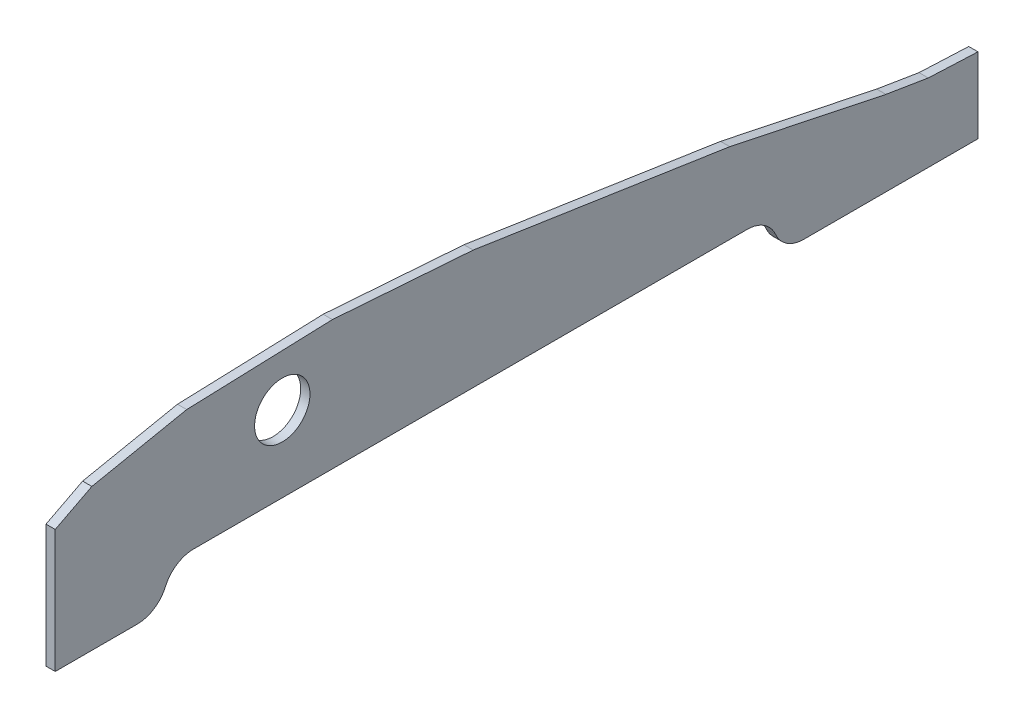
ISO-10303-21;
HEADER;
FILE_DESCRIPTION(('STEP AP214'),'2;1');
FILE_NAME('part.step','',(''),(''),'','','');
FILE_SCHEMA(('AUTOMOTIVE_DESIGN { 1 0 10303 214 1 1 1 1 }'));
ENDSEC;
DATA;
#1=APPLICATION_CONTEXT('core data for automotive mechanical design processes');
#2=APPLICATION_PROTOCOL_DEFINITION('international standard','automotive_design',2000,#1);
#3=PRODUCT_CONTEXT('',#1,'mechanical');
#4=PRODUCT('Part','Part','',(#3));
#5=PRODUCT_RELATED_PRODUCT_CATEGORY('part','',(#4));
#6=PRODUCT_DEFINITION_FORMATION('','',#4);
#7=PRODUCT_DEFINITION_CONTEXT('part definition',#1,'design');
#8=PRODUCT_DEFINITION('design','',#6,#7);
#9=PRODUCT_DEFINITION_SHAPE('','',#8);
#10=(LENGTH_UNIT() NAMED_UNIT(*) SI_UNIT(.MILLI.,.METRE.));
#11=(NAMED_UNIT(*) PLANE_ANGLE_UNIT() SI_UNIT($,.RADIAN.));
#12=(NAMED_UNIT(*) SI_UNIT($,.STERADIAN.) SOLID_ANGLE_UNIT());
#13=UNCERTAINTY_MEASURE_WITH_UNIT(LENGTH_MEASURE(1.E-05),#10,'distance_accuracy_value','');
#14=(GEOMETRIC_REPRESENTATION_CONTEXT(3) GLOBAL_UNCERTAINTY_ASSIGNED_CONTEXT((#13)) GLOBAL_UNIT_ASSIGNED_CONTEXT((#10,
#11,#12)) REPRESENTATION_CONTEXT('',''));
#15=CARTESIAN_POINT('',(0.,0.,0.));
#16=DIRECTION('',(0.,0.,1.));
#17=DIRECTION('',(1.,0.,0.));
#18=AXIS2_PLACEMENT_3D('',#15,#16,#17);
#19=CARTESIAN_POINT('',(3.,-40.,0.));
#20=DIRECTION('',(0.,1.,0.));
#21=DIRECTION('',(0.,0.,1.));
#22=AXIS2_PLACEMENT_3D('',#19,#20,#21);
#23=PLANE('',#22);
#24=DIRECTION('',(0.,0.,-1.));
#25=VECTOR('',#24,1.);
#26=CARTESIAN_POINT('',(0.,-40.,0.));
#27=LINE('',#26,#25);
#28=CARTESIAN_POINT('',(0.,-40.,0.));
#29=VERTEX_POINT('',#28);
#30=CARTESIAN_POINT('',(0.,-40.,-26.6696972201766));
#31=VERTEX_POINT('',#30);
#32=EDGE_CURVE('E221',#29,#31,#27,.T.);
#33=ORIENTED_EDGE('',*,*,#32,.T.);
#34=DIRECTION('',(1.,0.,0.));
#35=VECTOR('',#34,1.);
#36=CARTESIAN_POINT('',(3.,-40.,-26.6696972201766));
#37=LINE('',#36,#35);
#38=CARTESIAN_POINT('',(3.,-40.,-26.6696972201766));
#39=VERTEX_POINT('',#38);
#40=EDGE_CURVE('E45',#31,#39,#37,.T.);
#41=ORIENTED_EDGE('',*,*,#40,.T.);
#42=DIRECTION('',(0.,0.,-1.));
#43=VECTOR('',#42,1.);
#44=CARTESIAN_POINT('',(3.,-40.,0.));
#45=LINE('',#44,#43);
#46=CARTESIAN_POINT('',(3.,-40.,0.));
#47=VERTEX_POINT('',#46);
#48=EDGE_CURVE('E196',#47,#39,#45,.T.);
#49=ORIENTED_EDGE('',*,*,#48,.F.);
#50=DIRECTION('',(-1.,0.,0.));
#51=VECTOR('',#50,1.);
#52=CARTESIAN_POINT('',(3.,-40.,0.));
#53=LINE('',#52,#51);
#54=EDGE_CURVE('E269',#47,#29,#53,.T.);
#55=ORIENTED_EDGE('',*,*,#54,.T.);
#56=EDGE_LOOP('',(#33,#41,#49,#55));
#57=FACE_BOUND('',#56,.T.);
#58=ADVANCED_FACE('F37',(#57),#23,.F.);
#59=CARTESIAN_POINT('',(3.,0.,0.));
#60=DIRECTION('',(0.,0.,-1.));
#61=DIRECTION('',(0.,1.,0.));
#62=AXIS2_PLACEMENT_3D('',#59,#60,#61);
#63=PLANE('',#62);
#64=DIRECTION('',(0.,-1.,0.));
#65=VECTOR('',#64,1.);
#66=CARTESIAN_POINT('',(0.,0.,0.));
#67=LINE('',#66,#65);
#68=CARTESIAN_POINT('',(0.,0.,0.));
#69=VERTEX_POINT('',#68);
#70=EDGE_CURVE('E189',#69,#29,#67,.T.);
#71=ORIENTED_EDGE('',*,*,#70,.T.);
#72=ORIENTED_EDGE('',*,*,#54,.F.);
#73=DIRECTION('',(0.,-1.,0.));
#74=VECTOR('',#73,1.);
#75=CARTESIAN_POINT('',(3.,0.,0.));
#76=LINE('',#75,#74);
#77=CARTESIAN_POINT('',(3.,0.,0.));
#78=VERTEX_POINT('',#77);
#79=EDGE_CURVE('E191',#78,#47,#76,.T.);
#80=ORIENTED_EDGE('',*,*,#79,.F.);
#81=DIRECTION('',(-1.,0.,0.));
#82=VECTOR('',#81,1.);
#83=CARTESIAN_POINT('',(3.,0.,0.));
#84=LINE('',#83,#82);
#85=EDGE_CURVE('E217',#78,#69,#84,.T.);
#86=ORIENTED_EDGE('',*,*,#85,.T.);
#87=EDGE_LOOP('',(#71,#72,#80,#86));
#88=FACE_BOUND('',#87,.T.);
#89=ADVANCED_FACE('F293',(#88),#63,.F.);
#90=CARTESIAN_POINT('',(3.,-40.,-243.330302779823));
#91=VERTEX_POINT('',#90);
#92=CARTESIAN_POINT('',(3.,-40.,-299.988096251268));
#93=VERTEX_POINT('',#92);
#94=EDGE_CURVE('E194',#91,#93,#45,.T.);
#95=ORIENTED_EDGE('',*,*,#94,.F.);
#96=DIRECTION('',(1.,0.,0.));
#97=VECTOR('',#96,1.);
#98=CARTESIAN_POINT('',(3.,-40.,-243.330302779823));
#99=LINE('',#98,#97);
#100=CARTESIAN_POINT('',(0.,-40.,-243.330302779823));
#101=VERTEX_POINT('',#100);
#102=EDGE_CURVE('E278',#91,#101,#99,.F.);
#103=ORIENTED_EDGE('',*,*,#102,.T.);
#104=CARTESIAN_POINT('',(0.,-40.,-299.988096251268));
#105=VERTEX_POINT('',#104);
#106=EDGE_CURVE('E220',#101,#105,#27,.T.);
#107=ORIENTED_EDGE('',*,*,#106,.T.);
#108=DIRECTION('',(-1.,0.,0.));
#109=VECTOR('',#108,1.);
#110=CARTESIAN_POINT('',(3.,-40.,-299.988096251268));
#111=LINE('',#110,#109);
#112=EDGE_CURVE('E266',#93,#105,#111,.T.);
#113=ORIENTED_EDGE('',*,*,#112,.F.);
#114=EDGE_LOOP('',(#95,#103,#107,#113));
#115=FACE_BOUND('',#114,.T.);
#116=ADVANCED_FACE('F355',(#115),#23,.F.);
#117=CARTESIAN_POINT('',(3.,-40.,-299.988096251268));
#118=DIRECTION('',(0.,0.,1.));
#119=DIRECTION('',(1.,0.,0.));
#120=AXIS2_PLACEMENT_3D('',#117,#118,#119);
#121=PLANE('',#120);
#122=DIRECTION('',(0.,1.,0.));
#123=VECTOR('',#122,1.);
#124=CARTESIAN_POINT('',(0.,-40.,-299.988096251268));
#125=LINE('',#124,#123);
#126=CARTESIAN_POINT('',(0.,-15.5173621646129,-299.988096251268));
#127=VERTEX_POINT('',#126);
#128=EDGE_CURVE('E223',#105,#127,#125,.T.);
#129=ORIENTED_EDGE('',*,*,#128,.T.);
#130=DIRECTION('',(-1.,0.,0.));
#131=VECTOR('',#130,1.);
#132=CARTESIAN_POINT('',(3.,-15.5173621646129,-299.988096251268));
#133=LINE('',#132,#131);
#134=CARTESIAN_POINT('',(3.,-15.5173621646129,-299.988096251268));
#135=VERTEX_POINT('',#134);
#136=EDGE_CURVE('E263',#135,#127,#133,.T.);
#137=ORIENTED_EDGE('',*,*,#136,.F.);
#138=DIRECTION('',(0.,1.,0.));
#139=VECTOR('',#138,1.);
#140=CARTESIAN_POINT('',(3.,-40.,-299.988096251268));
#141=LINE('',#140,#139);
#142=EDGE_CURVE('E199',#93,#135,#141,.T.);
#143=ORIENTED_EDGE('',*,*,#142,.F.);
#144=ORIENTED_EDGE('',*,*,#112,.T.);
#145=EDGE_LOOP('',(#129,#137,#143,#144));
#146=FACE_BOUND('',#145,.T.);
#147=ADVANCED_FACE('F337',(#146),#121,.F.);
#148=CARTESIAN_POINT('',(3.,-14.7928826141457,-283.82314628147));
#149=DIRECTION('',(0.,-0.998997187171861,0.0447729831785717));
#150=DIRECTION('',(0.,-0.0447729831785717,-0.998997187171862));
#151=AXIS2_PLACEMENT_3D('',#148,#149,#150);
#152=PLANE('',#151);
#153=DIRECTION('',(0.,0.0447729831785717,0.998997187171862));
#154=VECTOR('',#153,1.);
#155=CARTESIAN_POINT('',(0.,-14.7928826141457,-283.82314628147));
#156=LINE('',#155,#154);
#157=CARTESIAN_POINT('',(0.,-14.7928826141457,-283.82314628147));
#158=VERTEX_POINT('',#157);
#159=EDGE_CURVE('E225',#127,#158,#156,.T.);
#160=ORIENTED_EDGE('',*,*,#159,.T.);
#161=DIRECTION('',(-1.,0.,0.));
#162=VECTOR('',#161,1.);
#163=CARTESIAN_POINT('',(3.,-14.7928826141457,-283.82314628147));
#164=LINE('',#163,#162);
#165=CARTESIAN_POINT('',(3.,-14.7928826141457,-283.82314628147));
#166=VERTEX_POINT('',#165);
#167=EDGE_CURVE('E260',#166,#158,#164,.T.);
#168=ORIENTED_EDGE('',*,*,#167,.F.);
#169=DIRECTION('',(0.,0.0447729831785717,0.998997187171862));
#170=VECTOR('',#169,1.);
#171=CARTESIAN_POINT('',(3.,-14.7928826141457,-283.82314628147));
#172=LINE('',#171,#170);
#173=EDGE_CURVE('E201',#135,#166,#172,.T.);
#174=ORIENTED_EDGE('',*,*,#173,.F.);
#175=ORIENTED_EDGE('',*,*,#136,.T.);
#176=EDGE_LOOP('',(#160,#168,#174,#175));
#177=FACE_BOUND('',#176,.T.);
#178=ADVANCED_FACE('F333',(#177),#152,.F.);
#179=CARTESIAN_POINT('',(3.,-12.5326394818578,-270.057015240594));
#180=DIRECTION('',(0.,-0.986787578203205,0.162019367681314));
#181=DIRECTION('',(0.,-0.162019367681314,-0.986787578203206));
#182=AXIS2_PLACEMENT_3D('',#179,#180,#181);
#183=PLANE('',#182);
#184=DIRECTION('',(0.,0.162019367681314,0.986787578203205));
#185=VECTOR('',#184,1.);
#186=CARTESIAN_POINT('',(0.,-12.5326394818578,-270.057015240594));
#187=LINE('',#186,#185);
#188=CARTESIAN_POINT('',(0.,-12.5326394818578,-270.057015240594));
#189=VERTEX_POINT('',#188);
#190=EDGE_CURVE('E227',#158,#189,#187,.T.);
#191=ORIENTED_EDGE('',*,*,#190,.T.);
#192=DIRECTION('',(-1.,0.,0.));
#193=VECTOR('',#192,1.);
#194=CARTESIAN_POINT('',(3.,-12.5326394818578,-270.057015240594));
#195=LINE('',#194,#193);
#196=CARTESIAN_POINT('',(3.,-12.5326394818578,-270.057015240594));
#197=VERTEX_POINT('',#196);
#198=EDGE_CURVE('E257',#197,#189,#195,.T.);
#199=ORIENTED_EDGE('',*,*,#198,.F.);
#200=DIRECTION('',(0.,0.162019367681314,0.986787578203205));
#201=VECTOR('',#200,1.);
#202=CARTESIAN_POINT('',(3.,-12.5326394818578,-270.057015240594));
#203=LINE('',#202,#201);
#204=EDGE_CURVE('E203',#166,#197,#203,.T.);
#205=ORIENTED_EDGE('',*,*,#204,.F.);
#206=ORIENTED_EDGE('',*,*,#167,.T.);
#207=EDGE_LOOP('',(#191,#199,#205,#206));
#208=FACE_BOUND('',#207,.T.);
#209=ADVANCED_FACE('F328',(#208),#183,.F.);
#210=CARTESIAN_POINT('',(3.,-1.87671343063835,-219.28748806685));
#211=DIRECTION('',(0.,-0.97867549249327,0.205412464064515));
#212=DIRECTION('',(0.,-0.205412464064515,-0.97867549249327));
#213=AXIS2_PLACEMENT_3D('',#210,#211,#212);
#214=PLANE('',#213);
#215=DIRECTION('',(0.,0.205412464064515,0.97867549249327));
#216=VECTOR('',#215,1.);
#217=CARTESIAN_POINT('',(0.,-1.87671343063835,-219.28748806685));
#218=LINE('',#217,#216);
#219=CARTESIAN_POINT('',(0.,-1.87671343063835,-219.28748806685));
#220=VERTEX_POINT('',#219);
#221=EDGE_CURVE('E229',#189,#220,#218,.T.);
#222=ORIENTED_EDGE('',*,*,#221,.T.);
#223=DIRECTION('',(-1.,0.,0.));
#224=VECTOR('',#223,1.);
#225=CARTESIAN_POINT('',(3.,-1.87671343063835,-219.28748806685));
#226=LINE('',#225,#224);
#227=CARTESIAN_POINT('',(3.,-1.87671343063835,-219.28748806685));
#228=VERTEX_POINT('',#227);
#229=EDGE_CURVE('E254',#228,#220,#226,.T.);
#230=ORIENTED_EDGE('',*,*,#229,.F.);
#231=DIRECTION('',(0.,0.205412464064515,0.97867549249327));
#232=VECTOR('',#231,1.);
#233=CARTESIAN_POINT('',(3.,-1.87671343063835,-219.28748806685));
#234=LINE('',#233,#232);
#235=EDGE_CURVE('E205',#197,#228,#234,.T.);
#236=ORIENTED_EDGE('',*,*,#235,.F.);
#237=ORIENTED_EDGE('',*,*,#198,.T.);
#238=EDGE_LOOP('',(#222,#230,#236,#237));
#239=FACE_BOUND('',#238,.T.);
#240=ADVANCED_FACE('F322',(#239),#214,.F.);
#241=CARTESIAN_POINT('',(3.,10.7137046441607,-135.887385091605));
#242=DIRECTION('',(0.,-0.988796071204043,0.149272668534629));
#243=DIRECTION('',(0.,-0.149272668534629,-0.988796071204043));
#244=AXIS2_PLACEMENT_3D('',#241,#242,#243);
#245=PLANE('',#244);
#246=DIRECTION('',(0.,0.149272668534629,0.988796071204043));
#247=VECTOR('',#246,1.);
#248=CARTESIAN_POINT('',(0.,10.7137046441607,-135.887385091605));
#249=LINE('',#248,#247);
#250=CARTESIAN_POINT('',(0.,10.7137046441607,-135.887385091605));
#251=VERTEX_POINT('',#250);
#252=EDGE_CURVE('E231',#220,#251,#249,.T.);
#253=ORIENTED_EDGE('',*,*,#252,.T.);
#254=DIRECTION('',(-1.,0.,0.));
#255=VECTOR('',#254,1.);
#256=CARTESIAN_POINT('',(3.,10.7137046441607,-135.887385091605));
#257=LINE('',#256,#255);
#258=CARTESIAN_POINT('',(3.,10.7137046441607,-135.887385091605));
#259=VERTEX_POINT('',#258);
#260=EDGE_CURVE('E251',#259,#251,#257,.T.);
#261=ORIENTED_EDGE('',*,*,#260,.F.);
#262=DIRECTION('',(0.,0.149272668534629,0.988796071204043));
#263=VECTOR('',#262,1.);
#264=CARTESIAN_POINT('',(3.,10.7137046441607,-135.887385091605));
#265=LINE('',#264,#263);
#266=EDGE_CURVE('E207',#228,#259,#265,.T.);
#267=ORIENTED_EDGE('',*,*,#266,.F.);
#268=ORIENTED_EDGE('',*,*,#229,.T.);
#269=EDGE_LOOP('',(#253,#261,#267,#268));
#270=FACE_BOUND('',#269,.T.);
#271=ADVANCED_FACE('F318',(#270),#245,.F.);
#272=CARTESIAN_POINT('',(3.,14.0331367749664,-90.1067818042896));
#273=DIRECTION('',(0.,-0.997381658666845,0.0723175425119892));
#274=DIRECTION('',(0.,-0.0723175425119892,-0.997381658666845));
#275=AXIS2_PLACEMENT_3D('',#272,#273,#274);
#276=PLANE('',#275);
#277=DIRECTION('',(0.,0.0723175425119892,0.997381658666845));
#278=VECTOR('',#277,1.);
#279=CARTESIAN_POINT('',(0.,14.0331367749664,-90.1067818042896));
#280=LINE('',#279,#278);
#281=CARTESIAN_POINT('',(0.,14.0331367749664,-90.1067818042896));
#282=VERTEX_POINT('',#281);
#283=EDGE_CURVE('E233',#251,#282,#280,.T.);
#284=ORIENTED_EDGE('',*,*,#283,.T.);
#285=DIRECTION('',(-1.,0.,0.));
#286=VECTOR('',#285,1.);
#287=CARTESIAN_POINT('',(3.,14.0331367749664,-90.1067818042896));
#288=LINE('',#287,#286);
#289=CARTESIAN_POINT('',(3.,14.0331367749664,-90.1067818042896));
#290=VERTEX_POINT('',#289);
#291=EDGE_CURVE('E248',#290,#282,#288,.T.);
#292=ORIENTED_EDGE('',*,*,#291,.F.);
#293=DIRECTION('',(0.,0.0723175425119892,0.997381658666845));
#294=VECTOR('',#293,1.);
#295=CARTESIAN_POINT('',(3.,14.0331367749664,-90.1067818042896));
#296=LINE('',#295,#294);
#297=EDGE_CURVE('E209',#259,#290,#296,.T.);
#298=ORIENTED_EDGE('',*,*,#297,.F.);
#299=ORIENTED_EDGE('',*,*,#260,.T.);
#300=EDGE_LOOP('',(#284,#292,#298,#299));
#301=FACE_BOUND('',#300,.T.);
#302=ADVANCED_FACE('F313',(#301),#276,.F.);
#303=CARTESIAN_POINT('',(3.,12.3835210947957,-42.7394147653279));
#304=DIRECTION('',(0.,-0.99939412611154,-0.0348048946809296));
#305=DIRECTION('',(0.,0.0348048946809296,-0.99939412611154));
#306=AXIS2_PLACEMENT_3D('',#303,#304,#305);
#307=PLANE('',#306);
#308=DIRECTION('',(0.,-0.0348048946809296,0.99939412611154));
#309=VECTOR('',#308,1.);
#310=CARTESIAN_POINT('',(0.,12.3835210947957,-42.7394147653279));
#311=LINE('',#310,#309);
#312=CARTESIAN_POINT('',(0.,12.3835210947957,-42.7394147653279));
#313=VERTEX_POINT('',#312);
#314=EDGE_CURVE('E235',#282,#313,#311,.T.);
#315=ORIENTED_EDGE('',*,*,#314,.T.);
#316=DIRECTION('',(-1.,0.,0.));
#317=VECTOR('',#316,1.);
#318=CARTESIAN_POINT('',(3.,12.3835210947957,-42.7394147653279));
#319=LINE('',#318,#317);
#320=CARTESIAN_POINT('',(3.,12.3835210947957,-42.7394147653279));
#321=VERTEX_POINT('',#320);
#322=EDGE_CURVE('E245',#321,#313,#319,.T.);
#323=ORIENTED_EDGE('',*,*,#322,.F.);
#324=DIRECTION('',(0.,-0.0348048946809296,0.99939412611154));
#325=VECTOR('',#324,1.);
#326=CARTESIAN_POINT('',(3.,12.3835210947957,-42.7394147653279));
#327=LINE('',#326,#325);
#328=EDGE_CURVE('E211',#290,#321,#327,.T.);
#329=ORIENTED_EDGE('',*,*,#328,.F.);
#330=ORIENTED_EDGE('',*,*,#291,.T.);
#331=EDGE_LOOP('',(#315,#323,#329,#330));
#332=FACE_BOUND('',#331,.T.);
#333=ADVANCED_FACE('F307',(#332),#307,.F.);
#334=CARTESIAN_POINT('',(3.,6.15800492790661,-11.9107980940931));
#335=DIRECTION('',(0.,-0.980213366557945,-0.197943820366135));
#336=DIRECTION('',(0.,0.197943820366135,-0.980213366557945));
#337=AXIS2_PLACEMENT_3D('',#334,#335,#336);
#338=PLANE('',#337);
#339=DIRECTION('',(0.,-0.197943820366135,0.980213366557945));
#340=VECTOR('',#339,1.);
#341=CARTESIAN_POINT('',(0.,6.15800492790661,-11.9107980940931));
#342=LINE('',#341,#340);
#343=CARTESIAN_POINT('',(0.,6.15800492790661,-11.9107980940931));
#344=VERTEX_POINT('',#343);
#345=EDGE_CURVE('E237',#313,#344,#342,.T.);
#346=ORIENTED_EDGE('',*,*,#345,.T.);
#347=DIRECTION('',(-1.,0.,0.));
#348=VECTOR('',#347,1.);
#349=CARTESIAN_POINT('',(3.,6.15800492790661,-11.9107980940931));
#350=LINE('',#349,#348);
#351=CARTESIAN_POINT('',(3.,6.15800492790661,-11.9107980940931));
#352=VERTEX_POINT('',#351);
#353=EDGE_CURVE('E242',#352,#344,#350,.T.);
#354=ORIENTED_EDGE('',*,*,#353,.F.);
#355=DIRECTION('',(0.,-0.197943820366135,0.980213366557945));
#356=VECTOR('',#355,1.);
#357=CARTESIAN_POINT('',(3.,6.15800492790661,-11.9107980940931));
#358=LINE('',#357,#356);
#359=EDGE_CURVE('E213',#321,#352,#358,.T.);
#360=ORIENTED_EDGE('',*,*,#359,.F.);
#361=ORIENTED_EDGE('',*,*,#322,.T.);
#362=EDGE_LOOP('',(#346,#354,#360,#361));
#363=FACE_BOUND('',#362,.T.);
#364=ADVANCED_FACE('F303',(#363),#338,.F.);
#365=CARTESIAN_POINT('',(3.,0.,0.));
#366=DIRECTION('',(0.,-0.888301402826504,-0.459260947323485));
#367=DIRECTION('',(0.,0.459260947323485,-0.888301402826504));
#368=AXIS2_PLACEMENT_3D('',#365,#366,#367);
#369=PLANE('',#368);
#370=DIRECTION('',(0.,-0.459260947323485,0.888301402826504));
#371=VECTOR('',#370,1.);
#372=CARTESIAN_POINT('',(0.,0.,0.));
#373=LINE('',#372,#371);
#374=EDGE_CURVE('E195',#344,#69,#373,.T.);
#375=ORIENTED_EDGE('',*,*,#374,.T.);
#376=ORIENTED_EDGE('',*,*,#85,.F.);
#377=DIRECTION('',(0.,-0.459260947323485,0.888301402826504));
#378=VECTOR('',#377,1.);
#379=CARTESIAN_POINT('',(3.,0.,0.));
#380=LINE('',#379,#378);
#381=EDGE_CURVE('E215',#352,#78,#380,.T.);
#382=ORIENTED_EDGE('',*,*,#381,.F.);
#383=ORIENTED_EDGE('',*,*,#353,.T.);
#384=EDGE_LOOP('',(#375,#376,#382,#383));
#385=FACE_BOUND('',#384,.T.);
#386=ADVANCED_FACE('F299',(#385),#369,.F.);
#387=CARTESIAN_POINT('',(3.,0.,0.));
#388=DIRECTION('',(1.,0.,0.));
#389=DIRECTION('',(0.,0.,-1.));
#390=AXIS2_PLACEMENT_3D('',#387,#388,#389);
#391=PLANE('',#390);
#392=CARTESIAN_POINT('',(3.,-3.27,-73.81));
#393=DIRECTION('',(1.,0.,0.));
#394=DIRECTION('',(0.,0.,-1.));
#395=AXIS2_PLACEMENT_3D('',#392,#393,#394);
#396=CIRCLE('',#395,9.);
#397=CARTESIAN_POINT('',(3.,-3.27,-82.81));
#398=VERTEX_POINT('',#397);
#399=EDGE_CURVE('E549',#398,#398,#396,.T.);
#400=ORIENTED_EDGE('',*,*,#399,.F.);
#401=EDGE_LOOP('',(#400));
#402=FACE_BOUND('',#401,.T.);
#403=CARTESIAN_POINT('',(3.,-38.,-225.));
#404=DIRECTION('',(1.,0.,0.));
#405=DIRECTION('',(0.,0.,1.));
#406=AXIS2_PLACEMENT_3D('',#403,#404,#405);
#407=CIRCLE('',#406,10.);
#408=CARTESIAN_POINT('',(3.,-34.,-234.165151389912));
#409=VERTEX_POINT('',#408);
#410=CARTESIAN_POINT('',(3.,-28.,-225.));
#411=VERTEX_POINT('',#410);
#412=EDGE_CURVE('E172',#409,#411,#407,.T.);
#413=ORIENTED_EDGE('',*,*,#412,.F.);
#414=CARTESIAN_POINT('',(3.,-30.,-243.330302779823));
#415=DIRECTION('',(1.,0.,0.));
#416=DIRECTION('',(0.,0.,-1.));
#417=AXIS2_PLACEMENT_3D('',#414,#415,#416);
#418=CIRCLE('',#417,10.);
#419=EDGE_CURVE('E276',#409,#91,#418,.T.);
#420=ORIENTED_EDGE('',*,*,#419,.T.);
#421=ORIENTED_EDGE('',*,*,#94,.T.);
#422=ORIENTED_EDGE('',*,*,#142,.T.);
#423=ORIENTED_EDGE('',*,*,#173,.T.);
#424=ORIENTED_EDGE('',*,*,#204,.T.);
#425=ORIENTED_EDGE('',*,*,#235,.T.);
#426=ORIENTED_EDGE('',*,*,#266,.T.);
#427=ORIENTED_EDGE('',*,*,#297,.T.);
#428=ORIENTED_EDGE('',*,*,#328,.T.);
#429=ORIENTED_EDGE('',*,*,#359,.T.);
#430=ORIENTED_EDGE('',*,*,#381,.T.);
#431=ORIENTED_EDGE('',*,*,#79,.T.);
#432=ORIENTED_EDGE('',*,*,#48,.T.);
#433=CARTESIAN_POINT('',(3.,-30.,-26.6696972201766));
#434=DIRECTION('',(1.,0.,0.));
#435=DIRECTION('',(0.,0.,-1.));
#436=AXIS2_PLACEMENT_3D('',#433,#434,#435);
#437=CIRCLE('',#436,10.);
#438=CARTESIAN_POINT('',(3.,-34.,-35.8348486100883));
#439=VERTEX_POINT('',#438);
#440=EDGE_CURVE('E274',#39,#439,#437,.T.);
#441=ORIENTED_EDGE('',*,*,#440,.T.);
#442=CARTESIAN_POINT('',(3.,-38.,-45.));
#443=DIRECTION('',(1.,0.,0.));
#444=DIRECTION('',(0.,0.,1.));
#445=AXIS2_PLACEMENT_3D('',#442,#443,#444);
#446=CIRCLE('',#445,9.99999999999999);
#447=CARTESIAN_POINT('',(3.,-28.,-45.0000000000001));
#448=VERTEX_POINT('',#447);
#449=EDGE_CURVE('E166',#448,#439,#446,.T.);
#450=ORIENTED_EDGE('',*,*,#449,.F.);
#451=DIRECTION('',(0.,0.,1.));
#452=VECTOR('',#451,1.);
#453=CARTESIAN_POINT('',(3.,-28.,-45.0000000000001));
#454=LINE('',#453,#452);
#455=EDGE_CURVE('E185',#411,#448,#454,.T.);
#456=ORIENTED_EDGE('',*,*,#455,.F.);
#457=EDGE_LOOP('',(#413,#420,#421,#422,#423,#424,#425,#426,#427,#428,#429,#430,#431,#432,#441,
#450,#456));
#458=FACE_BOUND('',#457,.T.);
#459=ADVANCED_FACE('F286',(#402,#458),#391,.T.);
#460=CARTESIAN_POINT('',(0.,0.,0.));
#461=DIRECTION('',(1.,0.,0.));
#462=DIRECTION('',(0.,0.,-1.));
#463=AXIS2_PLACEMENT_3D('',#460,#461,#462);
#464=PLANE('',#463);
#465=CARTESIAN_POINT('',(0.,-3.27,-73.81));
#466=DIRECTION('',(1.,0.,0.));
#467=DIRECTION('',(0.,0.,-1.));
#468=AXIS2_PLACEMENT_3D('',#465,#466,#467);
#469=CIRCLE('',#468,9.);
#470=CARTESIAN_POINT('',(0.,-3.27,-82.81));
#471=VERTEX_POINT('',#470);
#472=EDGE_CURVE('E186',#471,#471,#469,.T.);
#473=ORIENTED_EDGE('',*,*,#472,.T.);
#474=EDGE_LOOP('',(#473));
#475=FACE_BOUND('',#474,.T.);
#476=ORIENTED_EDGE('',*,*,#106,.F.);
#477=CARTESIAN_POINT('',(0.,-30.,-243.330302779823));
#478=DIRECTION('',(1.,0.,0.));
#479=DIRECTION('',(0.,0.,-1.));
#480=AXIS2_PLACEMENT_3D('',#477,#478,#479);
#481=CIRCLE('',#480,10.);
#482=CARTESIAN_POINT('',(0.,-34.,-234.165151389912));
#483=VERTEX_POINT('',#482);
#484=EDGE_CURVE('E162',#101,#483,#481,.F.);
#485=ORIENTED_EDGE('',*,*,#484,.T.);
#486=CARTESIAN_POINT('',(0.,-38.,-225.));
#487=DIRECTION('',(1.,0.,0.));
#488=DIRECTION('',(0.,0.,1.));
#489=AXIS2_PLACEMENT_3D('',#486,#487,#488);
#490=CIRCLE('',#489,10.);
#491=CARTESIAN_POINT('',(0.,-28.,-225.));
#492=VERTEX_POINT('',#491);
#493=EDGE_CURVE('E155',#483,#492,#490,.T.);
#494=ORIENTED_EDGE('',*,*,#493,.T.);
#495=DIRECTION('',(0.,0.,1.));
#496=VECTOR('',#495,1.);
#497=CARTESIAN_POINT('',(0.,-28.,-45.0000000000001));
#498=LINE('',#497,#496);
#499=CARTESIAN_POINT('',(0.,-28.,-45.0000000000001));
#500=VERTEX_POINT('',#499);
#501=EDGE_CURVE('E160',#492,#500,#498,.T.);
#502=ORIENTED_EDGE('',*,*,#501,.T.);
#503=CARTESIAN_POINT('',(0.,-38.,-45.));
#504=DIRECTION('',(1.,0.,0.));
#505=DIRECTION('',(0.,0.,1.));
#506=AXIS2_PLACEMENT_3D('',#503,#504,#505);
#507=CIRCLE('',#506,9.99999999999999);
#508=CARTESIAN_POINT('',(0.,-34.,-35.8348486100883));
#509=VERTEX_POINT('',#508);
#510=EDGE_CURVE('E177',#500,#509,#507,.T.);
#511=ORIENTED_EDGE('',*,*,#510,.T.);
#512=CARTESIAN_POINT('',(0.,-30.,-26.6696972201766));
#513=DIRECTION('',(1.,0.,0.));
#514=DIRECTION('',(0.,0.,-1.));
#515=AXIS2_PLACEMENT_3D('',#512,#513,#514);
#516=CIRCLE('',#515,10.);
#517=EDGE_CURVE('E52',#509,#31,#516,.F.);
#518=ORIENTED_EDGE('',*,*,#517,.T.);
#519=ORIENTED_EDGE('',*,*,#32,.F.);
#520=ORIENTED_EDGE('',*,*,#70,.F.);
#521=ORIENTED_EDGE('',*,*,#374,.F.);
#522=ORIENTED_EDGE('',*,*,#345,.F.);
#523=ORIENTED_EDGE('',*,*,#314,.F.);
#524=ORIENTED_EDGE('',*,*,#283,.F.);
#525=ORIENTED_EDGE('',*,*,#252,.F.);
#526=ORIENTED_EDGE('',*,*,#221,.F.);
#527=ORIENTED_EDGE('',*,*,#190,.F.);
#528=ORIENTED_EDGE('',*,*,#159,.F.);
#529=ORIENTED_EDGE('',*,*,#128,.F.);
#530=EDGE_LOOP('',(#476,#485,#494,#502,#511,#518,#519,#520,#521,#522,#523,#524,#525,#526,#527,
#528,#529));
#531=FACE_BOUND('',#530,.T.);
#532=ADVANCED_FACE('F158',(#475,#531),#464,.F.);
#533=CARTESIAN_POINT('',(0.,-38.,-45.));
#534=DIRECTION('',(1.,0.,0.));
#535=DIRECTION('',(0.,0.,-1.));
#536=AXIS2_PLACEMENT_3D('',#533,#534,#535);
#537=CYLINDRICAL_SURFACE('',#536,9.99999999999999);
#538=ORIENTED_EDGE('',*,*,#449,.T.);
#539=DIRECTION('',(1.,0.,0.));
#540=VECTOR('',#539,1.);
#541=CARTESIAN_POINT('',(0.,-34.,-35.8348486100883));
#542=LINE('',#541,#540);
#543=EDGE_CURVE('E11',#439,#509,#542,.F.);
#544=ORIENTED_EDGE('',*,*,#543,.T.);
#545=ORIENTED_EDGE('',*,*,#510,.F.);
#546=DIRECTION('',(1.,0.,0.));
#547=VECTOR('',#546,1.);
#548=CARTESIAN_POINT('',(0.,-28.,-45.0000000000001));
#549=LINE('',#548,#547);
#550=EDGE_CURVE('E176',#500,#448,#549,.T.);
#551=ORIENTED_EDGE('',*,*,#550,.T.);
#552=EDGE_LOOP('',(#538,#544,#545,#551));
#553=FACE_BOUND('',#552,.T.);
#554=ADVANCED_FACE('F344',(#553),#537,.F.);
#555=CARTESIAN_POINT('',(0.,-28.,-45.0000000000001));
#556=DIRECTION('',(0.,1.,0.));
#557=DIRECTION('',(0.,0.,1.));
#558=AXIS2_PLACEMENT_3D('',#555,#556,#557);
#559=PLANE('',#558);
#560=ORIENTED_EDGE('',*,*,#455,.T.);
#561=ORIENTED_EDGE('',*,*,#550,.F.);
#562=ORIENTED_EDGE('',*,*,#501,.F.);
#563=DIRECTION('',(1.,0.,0.));
#564=VECTOR('',#563,1.);
#565=CARTESIAN_POINT('',(0.,-28.,-225.));
#566=LINE('',#565,#564);
#567=EDGE_CURVE('E169',#492,#411,#566,.T.);
#568=ORIENTED_EDGE('',*,*,#567,.T.);
#569=EDGE_LOOP('',(#560,#561,#562,#568));
#570=FACE_BOUND('',#569,.T.);
#571=ADVANCED_FACE('F179',(#570),#559,.F.);
#572=CARTESIAN_POINT('',(0.,-38.,-225.));
#573=DIRECTION('',(1.,0.,0.));
#574=DIRECTION('',(0.,0.,-1.));
#575=AXIS2_PLACEMENT_3D('',#572,#573,#574);
#576=CYLINDRICAL_SURFACE('',#575,10.);
#577=ORIENTED_EDGE('',*,*,#493,.F.);
#578=DIRECTION('',(1.,0.,0.));
#579=VECTOR('',#578,1.);
#580=CARTESIAN_POINT('',(0.,-34.,-234.165151389912));
#581=LINE('',#580,#579);
#582=EDGE_CURVE('E272',#483,#409,#581,.T.);
#583=ORIENTED_EDGE('',*,*,#582,.T.);
#584=ORIENTED_EDGE('',*,*,#412,.T.);
#585=ORIENTED_EDGE('',*,*,#567,.F.);
#586=EDGE_LOOP('',(#577,#583,#584,#585));
#587=FACE_BOUND('',#586,.T.);
#588=ADVANCED_FACE('F170',(#587),#576,.F.);
#589=CARTESIAN_POINT('',(0.,-30.,-243.330302779823));
#590=DIRECTION('',(1.,0.,0.));
#591=DIRECTION('',(0.,0.,-1.));
#592=AXIS2_PLACEMENT_3D('',#589,#590,#591);
#593=CYLINDRICAL_SURFACE('',#592,10.);
#594=ORIENTED_EDGE('',*,*,#484,.F.);
#595=ORIENTED_EDGE('',*,*,#102,.F.);
#596=ORIENTED_EDGE('',*,*,#419,.F.);
#597=ORIENTED_EDGE('',*,*,#582,.F.);
#598=EDGE_LOOP('',(#594,#595,#596,#597));
#599=FACE_BOUND('',#598,.T.);
#600=ADVANCED_FACE('F342',(#599),#593,.T.);
#601=CARTESIAN_POINT('',(0.,-30.,-26.6696972201766));
#602=DIRECTION('',(1.,0.,0.));
#603=DIRECTION('',(0.,0.,-1.));
#604=AXIS2_PLACEMENT_3D('',#601,#602,#603);
#605=CYLINDRICAL_SURFACE('',#604,10.);
#606=ORIENTED_EDGE('',*,*,#517,.F.);
#607=ORIENTED_EDGE('',*,*,#543,.F.);
#608=ORIENTED_EDGE('',*,*,#440,.F.);
#609=ORIENTED_EDGE('',*,*,#40,.F.);
#610=EDGE_LOOP('',(#606,#607,#608,#609));
#611=FACE_BOUND('',#610,.T.);
#612=ADVANCED_FACE('F39',(#611),#605,.T.);
#613=CARTESIAN_POINT('',(0.,-3.27,-73.81));
#614=DIRECTION('',(1.,0.,0.));
#615=DIRECTION('',(0.,0.,-1.));
#616=AXIS2_PLACEMENT_3D('',#613,#614,#615);
#617=CYLINDRICAL_SURFACE('',#616,9.);
#618=ORIENTED_EDGE('',*,*,#472,.F.);
#619=EDGE_LOOP('',(#618));
#620=FACE_BOUND('',#619,.T.);
#621=ORIENTED_EDGE('',*,*,#399,.T.);
#622=EDGE_LOOP('',(#621));
#623=FACE_BOUND('',#622,.T.);
#624=ADVANCED_FACE('F346',(#620,#623),#617,.F.);
#625=CLOSED_SHELL('',(#58,#89,#116,#147,#178,#209,#240,#271,#302,#333,#364,#386,#459,#532,#554,
#571,#588,#600,#612,#624));
#626=MANIFOLD_SOLID_BREP('B2',#625);
#627=ADVANCED_BREP_SHAPE_REPRESENTATION('',(#18,#626),#14);
#628=SHAPE_DEFINITION_REPRESENTATION(#9,#627);
ENDSEC;
END-ISO-10303-21;
